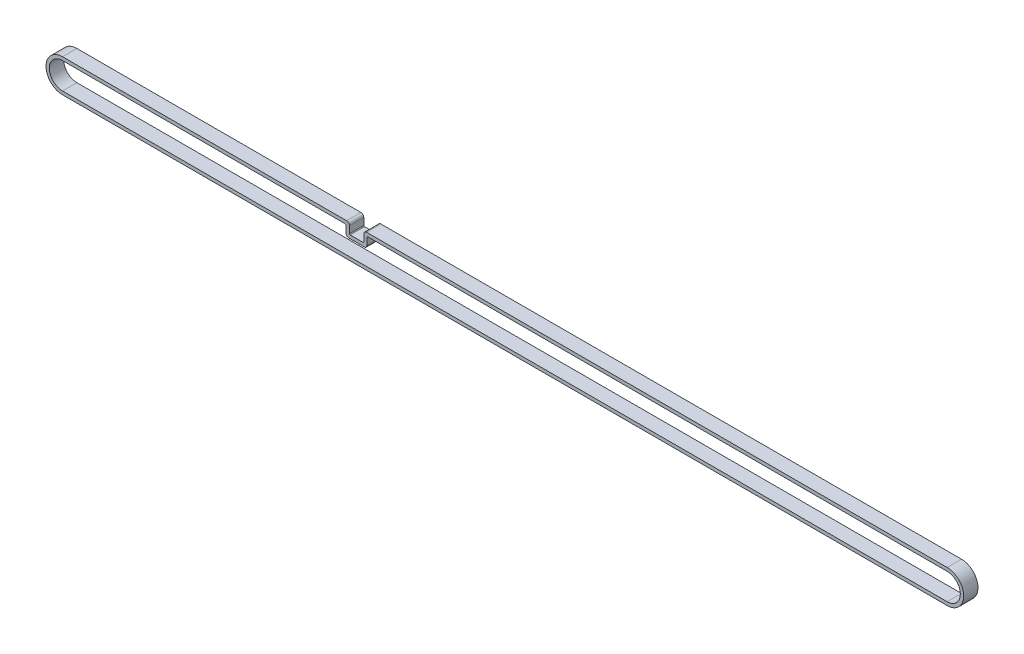
ISO-10303-21;
HEADER;
FILE_DESCRIPTION(('STEP AP214'),'2;1');
FILE_NAME('part.step','',(''),(''),'','','');
FILE_SCHEMA(('AUTOMOTIVE_DESIGN { 1 0 10303 214 1 1 1 1 }'));
ENDSEC;
DATA;
#1=APPLICATION_CONTEXT('core data for automotive mechanical design processes');
#2=APPLICATION_PROTOCOL_DEFINITION('international standard','automotive_design',2000,#1);
#3=PRODUCT_CONTEXT('',#1,'mechanical');
#4=PRODUCT('Part','Part','',(#3));
#5=PRODUCT_RELATED_PRODUCT_CATEGORY('part','',(#4));
#6=PRODUCT_DEFINITION_FORMATION('','',#4);
#7=PRODUCT_DEFINITION_CONTEXT('part definition',#1,'design');
#8=PRODUCT_DEFINITION('design','',#6,#7);
#9=PRODUCT_DEFINITION_SHAPE('','',#8);
#10=(LENGTH_UNIT() NAMED_UNIT(*) SI_UNIT(.MILLI.,.METRE.));
#11=(NAMED_UNIT(*) PLANE_ANGLE_UNIT() SI_UNIT($,.RADIAN.));
#12=(NAMED_UNIT(*) SI_UNIT($,.STERADIAN.) SOLID_ANGLE_UNIT());
#13=UNCERTAINTY_MEASURE_WITH_UNIT(LENGTH_MEASURE(1.E-05),#10,'distance_accuracy_value','');
#14=(GEOMETRIC_REPRESENTATION_CONTEXT(3) GLOBAL_UNCERTAINTY_ASSIGNED_CONTEXT((#13)) GLOBAL_UNIT_ASSIGNED_CONTEXT((#10,
#11,#12)) REPRESENTATION_CONTEXT('',''));
#15=CARTESIAN_POINT('',(0.,0.,0.));
#16=DIRECTION('',(0.,0.,1.));
#17=DIRECTION('',(1.,0.,0.));
#18=AXIS2_PLACEMENT_3D('',#15,#16,#17);
#19=CARTESIAN_POINT('',(0.,0.,6.));
#20=DIRECTION('',(0.,0.,1.));
#21=DIRECTION('',(1.,0.,0.));
#22=AXIS2_PLACEMENT_3D('',#19,#20,#21);
#23=PLANE('',#22);
#24=DIRECTION('',(-1.,0.,0.));
#25=VECTOR('',#24,1.);
#26=CARTESIAN_POINT('',(126.,6.9,6.));
#27=LINE('',#26,#25);
#28=CARTESIAN_POINT('',(370.,6.9,6.));
#29=VERTEX_POINT('',#28);
#30=CARTESIAN_POINT('',(127.2,6.9,6.));
#31=VERTEX_POINT('',#30);
#32=EDGE_CURVE('E268',#29,#31,#27,.T.);
#33=ORIENTED_EDGE('',*,*,#32,.T.);
#34=CARTESIAN_POINT('',(127.2,5.7,6.));
#35=DIRECTION('',(0.,0.,1.));
#36=DIRECTION('',(1.,0.,0.));
#37=AXIS2_PLACEMENT_3D('',#34,#35,#36);
#38=CIRCLE('',#37,1.2);
#39=CARTESIAN_POINT('',(126.,5.7,6.));
#40=VERTEX_POINT('',#39);
#41=EDGE_CURVE('E365',#31,#40,#38,.T.);
#42=ORIENTED_EDGE('',*,*,#41,.T.);
#43=DIRECTION('',(0.,-1.,0.));
#44=VECTOR('',#43,1.);
#45=CARTESIAN_POINT('',(126.,2.5,6.));
#46=LINE('',#45,#44);
#47=CARTESIAN_POINT('',(126.,2.8,6.));
#48=VERTEX_POINT('',#47);
#49=EDGE_CURVE('E271',#40,#48,#46,.T.);
#50=ORIENTED_EDGE('',*,*,#49,.T.);
#51=CARTESIAN_POINT('',(125.7,2.8,6.));
#52=DIRECTION('',(0.,0.,1.));
#53=DIRECTION('',(1.,0.,0.));
#54=AXIS2_PLACEMENT_3D('',#51,#52,#53);
#55=CIRCLE('',#54,0.3);
#56=CARTESIAN_POINT('',(125.7,2.5,6.));
#57=VERTEX_POINT('',#56);
#58=EDGE_CURVE('E343',#48,#57,#55,.F.);
#59=ORIENTED_EDGE('',*,*,#58,.T.);
#60=DIRECTION('',(-1.,0.,0.));
#61=VECTOR('',#60,1.);
#62=CARTESIAN_POINT('',(120.,2.5,6.));
#63=LINE('',#62,#61);
#64=CARTESIAN_POINT('',(120.3,2.5,6.));
#65=VERTEX_POINT('',#64);
#66=EDGE_CURVE('E273',#57,#65,#63,.T.);
#67=ORIENTED_EDGE('',*,*,#66,.T.);
#68=CARTESIAN_POINT('',(120.3,2.8,6.));
#69=DIRECTION('',(0.,0.,1.));
#70=DIRECTION('',(1.,0.,0.));
#71=AXIS2_PLACEMENT_3D('',#68,#69,#70);
#72=CIRCLE('',#71,0.3);
#73=CARTESIAN_POINT('',(120.,2.8,6.));
#74=VERTEX_POINT('',#73);
#75=EDGE_CURVE('E347',#65,#74,#72,.F.);
#76=ORIENTED_EDGE('',*,*,#75,.T.);
#77=DIRECTION('',(0.,1.,0.));
#78=VECTOR('',#77,1.);
#79=CARTESIAN_POINT('',(120.,6.9,6.));
#80=LINE('',#79,#78);
#81=CARTESIAN_POINT('',(120.,5.7,6.));
#82=VERTEX_POINT('',#81);
#83=EDGE_CURVE('E276',#74,#82,#80,.T.);
#84=ORIENTED_EDGE('',*,*,#83,.T.);
#85=CARTESIAN_POINT('',(118.8,5.7,6.));
#86=DIRECTION('',(0.,0.,1.));
#87=DIRECTION('',(1.,0.,0.));
#88=AXIS2_PLACEMENT_3D('',#85,#86,#87);
#89=CIRCLE('',#88,1.2);
#90=CARTESIAN_POINT('',(118.8,6.9,6.));
#91=VERTEX_POINT('',#90);
#92=EDGE_CURVE('E57',#82,#91,#89,.T.);
#93=ORIENTED_EDGE('',*,*,#92,.T.);
#94=DIRECTION('',(-1.,0.,0.));
#95=VECTOR('',#94,1.);
#96=CARTESIAN_POINT('',(0.,6.9,6.));
#97=LINE('',#96,#95);
#98=CARTESIAN_POINT('',(0.,6.9,6.));
#99=VERTEX_POINT('',#98);
#100=EDGE_CURVE('E278',#91,#99,#97,.T.);
#101=ORIENTED_EDGE('',*,*,#100,.T.);
#102=CARTESIAN_POINT('',(0.,0.,6.));
#103=DIRECTION('',(0.,0.,1.));
#104=DIRECTION('',(1.,0.,0.));
#105=AXIS2_PLACEMENT_3D('',#102,#103,#104);
#106=CIRCLE('',#105,6.9);
#107=CARTESIAN_POINT('',(0.,-6.9,6.));
#108=VERTEX_POINT('',#107);
#109=EDGE_CURVE('E260',#99,#108,#106,.T.);
#110=ORIENTED_EDGE('',*,*,#109,.T.);
#111=DIRECTION('',(1.,0.,0.));
#112=VECTOR('',#111,1.);
#113=CARTESIAN_POINT('',(0.,-6.9,6.));
#114=LINE('',#113,#112);
#115=CARTESIAN_POINT('',(370.,-6.9,6.));
#116=VERTEX_POINT('',#115);
#117=EDGE_CURVE('E263',#108,#116,#114,.T.);
#118=ORIENTED_EDGE('',*,*,#117,.T.);
#119=CARTESIAN_POINT('',(370.,0.,6.));
#120=DIRECTION('',(0.,0.,1.));
#121=DIRECTION('',(1.,0.,0.));
#122=AXIS2_PLACEMENT_3D('',#119,#120,#121);
#123=CIRCLE('',#122,6.9);
#124=EDGE_CURVE('E266',#116,#29,#123,.T.);
#125=ORIENTED_EDGE('',*,*,#124,.T.);
#126=EDGE_LOOP('',(#33,#42,#50,#59,#67,#76,#84,#93,#101,#110,#118,#125));
#127=FACE_BOUND('',#126,.T.);
#128=DIRECTION('',(0.,1.,0.));
#129=VECTOR('',#128,1.);
#130=CARTESIAN_POINT('',(118.6,5.5,6.));
#131=LINE('',#130,#129);
#132=CARTESIAN_POINT('',(118.6,2.3,6.));
#133=VERTEX_POINT('',#132);
#134=CARTESIAN_POINT('',(118.6,5.2,6.));
#135=VERTEX_POINT('',#134);
#136=EDGE_CURVE('E234',#133,#135,#131,.T.);
#137=ORIENTED_EDGE('',*,*,#136,.F.);
#138=CARTESIAN_POINT('',(119.8,2.3,6.));
#139=DIRECTION('',(0.,0.,1.));
#140=DIRECTION('',(1.,0.,0.));
#141=AXIS2_PLACEMENT_3D('',#138,#139,#140);
#142=CIRCLE('',#141,1.2);
#143=CARTESIAN_POINT('',(119.8,1.1,6.));
#144=VERTEX_POINT('',#143);
#145=EDGE_CURVE('E368',#133,#144,#142,.T.);
#146=ORIENTED_EDGE('',*,*,#145,.T.);
#147=DIRECTION('',(-1.,0.,0.));
#148=VECTOR('',#147,1.);
#149=CARTESIAN_POINT('',(118.6,1.1,6.));
#150=LINE('',#149,#148);
#151=CARTESIAN_POINT('',(126.2,1.1,6.));
#152=VERTEX_POINT('',#151);
#153=EDGE_CURVE('E231',#152,#144,#150,.T.);
#154=ORIENTED_EDGE('',*,*,#153,.F.);
#155=CARTESIAN_POINT('',(126.2,2.3,6.));
#156=DIRECTION('',(0.,0.,1.));
#157=DIRECTION('',(1.,0.,0.));
#158=AXIS2_PLACEMENT_3D('',#155,#156,#157);
#159=CIRCLE('',#158,1.2);
#160=CARTESIAN_POINT('',(127.4,2.3,6.));
#161=VERTEX_POINT('',#160);
#162=EDGE_CURVE('E49',#152,#161,#159,.T.);
#163=ORIENTED_EDGE('',*,*,#162,.T.);
#164=DIRECTION('',(0.,-1.,0.));
#165=VECTOR('',#164,1.);
#166=CARTESIAN_POINT('',(127.4,1.1,6.));
#167=LINE('',#166,#165);
#168=CARTESIAN_POINT('',(127.4,5.2,6.));
#169=VERTEX_POINT('',#168);
#170=EDGE_CURVE('E229',#169,#161,#167,.T.);
#171=ORIENTED_EDGE('',*,*,#170,.F.);
#172=CARTESIAN_POINT('',(127.7,5.2,6.));
#173=DIRECTION('',(0.,0.,1.));
#174=DIRECTION('',(1.,0.,0.));
#175=AXIS2_PLACEMENT_3D('',#172,#173,#174);
#176=CIRCLE('',#175,0.3);
#177=CARTESIAN_POINT('',(127.7,5.5,6.));
#178=VERTEX_POINT('',#177);
#179=EDGE_CURVE('E333',#169,#178,#176,.F.);
#180=ORIENTED_EDGE('',*,*,#179,.T.);
#181=DIRECTION('',(-1.,0.,0.));
#182=VECTOR('',#181,1.);
#183=CARTESIAN_POINT('',(127.4,5.5,6.));
#184=LINE('',#183,#182);
#185=CARTESIAN_POINT('',(370.,5.5,6.));
#186=VERTEX_POINT('',#185);
#187=EDGE_CURVE('E224',#186,#178,#184,.T.);
#188=ORIENTED_EDGE('',*,*,#187,.F.);
#189=CARTESIAN_POINT('',(370.,0.,6.));
#190=DIRECTION('',(0.,0.,1.));
#191=DIRECTION('',(1.,0.,0.));
#192=AXIS2_PLACEMENT_3D('',#189,#190,#191);
#193=CIRCLE('',#192,5.5);
#194=CARTESIAN_POINT('',(370.,-5.5,6.));
#195=VERTEX_POINT('',#194);
#196=EDGE_CURVE('E222',#195,#186,#193,.T.);
#197=ORIENTED_EDGE('',*,*,#196,.F.);
#198=DIRECTION('',(1.,0.,0.));
#199=VECTOR('',#198,1.);
#200=CARTESIAN_POINT('',(0.,-5.5,6.));
#201=LINE('',#200,#199);
#202=CARTESIAN_POINT('',(0.,-5.5,6.));
#203=VERTEX_POINT('',#202);
#204=EDGE_CURVE('E208',#203,#195,#201,.T.);
#205=ORIENTED_EDGE('',*,*,#204,.F.);
#206=CARTESIAN_POINT('',(0.,0.,6.));
#207=DIRECTION('',(0.,0.,1.));
#208=DIRECTION('',(1.,0.,0.));
#209=AXIS2_PLACEMENT_3D('',#206,#207,#208);
#210=CIRCLE('',#209,5.5);
#211=CARTESIAN_POINT('',(0.,5.5,6.));
#212=VERTEX_POINT('',#211);
#213=EDGE_CURVE('E198',#212,#203,#210,.T.);
#214=ORIENTED_EDGE('',*,*,#213,.F.);
#215=DIRECTION('',(-1.,0.,0.));
#216=VECTOR('',#215,1.);
#217=CARTESIAN_POINT('',(0.,5.5,6.));
#218=LINE('',#217,#216);
#219=CARTESIAN_POINT('',(118.3,5.5,6.));
#220=VERTEX_POINT('',#219);
#221=EDGE_CURVE('E236',#220,#212,#218,.T.);
#222=ORIENTED_EDGE('',*,*,#221,.F.);
#223=CARTESIAN_POINT('',(118.3,5.2,6.));
#224=DIRECTION('',(0.,0.,1.));
#225=DIRECTION('',(1.,0.,0.));
#226=AXIS2_PLACEMENT_3D('',#223,#224,#225);
#227=CIRCLE('',#226,0.3);
#228=EDGE_CURVE('E337',#220,#135,#227,.F.);
#229=ORIENTED_EDGE('',*,*,#228,.T.);
#230=EDGE_LOOP('',(#137,#146,#154,#163,#171,#180,#188,#197,#205,#214,#222,#229));
#231=FACE_BOUND('',#230,.T.);
#232=ADVANCED_FACE('F34',(#127,#231),#23,.T.);
#233=CARTESIAN_POINT('',(0.,0.,0.));
#234=DIRECTION('',(0.,0.,1.));
#235=DIRECTION('',(1.,0.,0.));
#236=AXIS2_PLACEMENT_3D('',#233,#234,#235);
#237=PLANE('',#236);
#238=DIRECTION('',(0.,-1.,0.));
#239=VECTOR('',#238,1.);
#240=CARTESIAN_POINT('',(126.,2.5,0.));
#241=LINE('',#240,#239);
#242=CARTESIAN_POINT('',(126.,5.7,0.));
#243=VERTEX_POINT('',#242);
#244=CARTESIAN_POINT('',(126.,2.8,0.));
#245=VERTEX_POINT('',#244);
#246=EDGE_CURVE('E290',#243,#245,#241,.T.);
#247=ORIENTED_EDGE('',*,*,#246,.F.);
#248=CARTESIAN_POINT('',(127.2,5.7,0.));
#249=DIRECTION('',(0.,0.,1.));
#250=DIRECTION('',(1.,0.,0.));
#251=AXIS2_PLACEMENT_3D('',#248,#249,#250);
#252=CIRCLE('',#251,1.2);
#253=CARTESIAN_POINT('',(127.2,6.9,0.));
#254=VERTEX_POINT('',#253);
#255=EDGE_CURVE('E356',#243,#254,#252,.F.);
#256=ORIENTED_EDGE('',*,*,#255,.T.);
#257=DIRECTION('',(-1.,0.,0.));
#258=VECTOR('',#257,1.);
#259=CARTESIAN_POINT('',(126.,6.9,0.));
#260=LINE('',#259,#258);
#261=CARTESIAN_POINT('',(370.,6.9,0.));
#262=VERTEX_POINT('',#261);
#263=EDGE_CURVE('E287',#262,#254,#260,.T.);
#264=ORIENTED_EDGE('',*,*,#263,.F.);
#265=CARTESIAN_POINT('',(370.,0.,0.));
#266=DIRECTION('',(0.,0.,1.));
#267=DIRECTION('',(1.,0.,0.));
#268=AXIS2_PLACEMENT_3D('',#265,#266,#267);
#269=CIRCLE('',#268,6.9);
#270=CARTESIAN_POINT('',(370.,-6.9,0.));
#271=VERTEX_POINT('',#270);
#272=EDGE_CURVE('E285',#271,#262,#269,.T.);
#273=ORIENTED_EDGE('',*,*,#272,.F.);
#274=DIRECTION('',(1.,0.,0.));
#275=VECTOR('',#274,1.);
#276=CARTESIAN_POINT('',(0.,-6.9,0.));
#277=LINE('',#276,#275);
#278=CARTESIAN_POINT('',(0.,-6.9,0.));
#279=VERTEX_POINT('',#278);
#280=EDGE_CURVE('E283',#279,#271,#277,.T.);
#281=ORIENTED_EDGE('',*,*,#280,.F.);
#282=CARTESIAN_POINT('',(0.,0.,0.));
#283=DIRECTION('',(0.,0.,1.));
#284=DIRECTION('',(1.,0.,0.));
#285=AXIS2_PLACEMENT_3D('',#282,#283,#284);
#286=CIRCLE('',#285,6.9);
#287=CARTESIAN_POINT('',(0.,6.9,0.));
#288=VERTEX_POINT('',#287);
#289=EDGE_CURVE('E216',#288,#279,#286,.T.);
#290=ORIENTED_EDGE('',*,*,#289,.F.);
#291=DIRECTION('',(-1.,0.,0.));
#292=VECTOR('',#291,1.);
#293=CARTESIAN_POINT('',(0.,6.9,0.));
#294=LINE('',#293,#292);
#295=CARTESIAN_POINT('',(118.8,6.9,0.));
#296=VERTEX_POINT('',#295);
#297=EDGE_CURVE('E264',#296,#288,#294,.T.);
#298=ORIENTED_EDGE('',*,*,#297,.F.);
#299=CARTESIAN_POINT('',(118.8,5.7,0.));
#300=DIRECTION('',(0.,0.,1.));
#301=DIRECTION('',(1.,0.,0.));
#302=AXIS2_PLACEMENT_3D('',#299,#300,#301);
#303=CIRCLE('',#302,1.2);
#304=CARTESIAN_POINT('',(120.,5.7,0.));
#305=VERTEX_POINT('',#304);
#306=EDGE_CURVE('E354',#296,#305,#303,.F.);
#307=ORIENTED_EDGE('',*,*,#306,.T.);
#308=DIRECTION('',(0.,1.,0.));
#309=VECTOR('',#308,1.);
#310=CARTESIAN_POINT('',(120.,6.9,0.));
#311=LINE('',#310,#309);
#312=CARTESIAN_POINT('',(120.,2.8,0.));
#313=VERTEX_POINT('',#312);
#314=EDGE_CURVE('E295',#313,#305,#311,.T.);
#315=ORIENTED_EDGE('',*,*,#314,.F.);
#316=CARTESIAN_POINT('',(120.3,2.8,0.));
#317=DIRECTION('',(0.,0.,1.));
#318=DIRECTION('',(1.,0.,0.));
#319=AXIS2_PLACEMENT_3D('',#316,#317,#318);
#320=CIRCLE('',#319,0.3);
#321=CARTESIAN_POINT('',(120.3,2.5,0.));
#322=VERTEX_POINT('',#321);
#323=EDGE_CURVE('E345',#313,#322,#320,.T.);
#324=ORIENTED_EDGE('',*,*,#323,.T.);
#325=DIRECTION('',(-1.,0.,0.));
#326=VECTOR('',#325,1.);
#327=CARTESIAN_POINT('',(120.,2.5,0.));
#328=LINE('',#327,#326);
#329=CARTESIAN_POINT('',(125.7,2.5,0.));
#330=VERTEX_POINT('',#329);
#331=EDGE_CURVE('E292',#330,#322,#328,.T.);
#332=ORIENTED_EDGE('',*,*,#331,.F.);
#333=CARTESIAN_POINT('',(125.7,2.8,0.));
#334=DIRECTION('',(0.,0.,1.));
#335=DIRECTION('',(1.,0.,0.));
#336=AXIS2_PLACEMENT_3D('',#333,#334,#335);
#337=CIRCLE('',#336,0.3);
#338=EDGE_CURVE('E340',#330,#245,#337,.T.);
#339=ORIENTED_EDGE('',*,*,#338,.T.);
#340=EDGE_LOOP('',(#247,#256,#264,#273,#281,#290,#298,#307,#315,#324,#332,#339));
#341=FACE_BOUND('',#340,.T.);
#342=DIRECTION('',(-1.,0.,0.));
#343=VECTOR('',#342,1.);
#344=CARTESIAN_POINT('',(118.6,1.1,0.));
#345=LINE('',#344,#343);
#346=CARTESIAN_POINT('',(126.2,1.1,0.));
#347=VERTEX_POINT('',#346);
#348=CARTESIAN_POINT('',(119.8,1.1,0.));
#349=VERTEX_POINT('',#348);
#350=EDGE_CURVE('E250',#347,#349,#345,.T.);
#351=ORIENTED_EDGE('',*,*,#350,.T.);
#352=CARTESIAN_POINT('',(119.8,2.3,0.));
#353=DIRECTION('',(0.,0.,1.));
#354=DIRECTION('',(1.,0.,0.));
#355=AXIS2_PLACEMENT_3D('',#352,#353,#354);
#356=CIRCLE('',#355,1.2);
#357=CARTESIAN_POINT('',(118.6,2.3,0.));
#358=VERTEX_POINT('',#357);
#359=EDGE_CURVE('E360',#349,#358,#356,.F.);
#360=ORIENTED_EDGE('',*,*,#359,.T.);
#361=DIRECTION('',(0.,1.,0.));
#362=VECTOR('',#361,1.);
#363=CARTESIAN_POINT('',(118.6,5.5,0.));
#364=LINE('',#363,#362);
#365=CARTESIAN_POINT('',(118.6,5.2,0.));
#366=VERTEX_POINT('',#365);
#367=EDGE_CURVE('E253',#358,#366,#364,.T.);
#368=ORIENTED_EDGE('',*,*,#367,.T.);
#369=CARTESIAN_POINT('',(118.3,5.2,0.));
#370=DIRECTION('',(0.,0.,1.));
#371=DIRECTION('',(1.,0.,0.));
#372=AXIS2_PLACEMENT_3D('',#369,#370,#371);
#373=CIRCLE('',#372,0.3);
#374=CARTESIAN_POINT('',(118.3,5.5,0.));
#375=VERTEX_POINT('',#374);
#376=EDGE_CURVE('E335',#366,#375,#373,.T.);
#377=ORIENTED_EDGE('',*,*,#376,.T.);
#378=DIRECTION('',(-1.,0.,0.));
#379=VECTOR('',#378,1.);
#380=CARTESIAN_POINT('',(0.,5.5,0.));
#381=LINE('',#380,#379);
#382=CARTESIAN_POINT('',(0.,5.5,0.));
#383=VERTEX_POINT('',#382);
#384=EDGE_CURVE('E209',#375,#383,#381,.T.);
#385=ORIENTED_EDGE('',*,*,#384,.T.);
#386=CARTESIAN_POINT('',(0.,0.,0.));
#387=DIRECTION('',(0.,0.,1.));
#388=DIRECTION('',(1.,0.,0.));
#389=AXIS2_PLACEMENT_3D('',#386,#387,#388);
#390=CIRCLE('',#389,5.5);
#391=CARTESIAN_POINT('',(0.,-5.5,0.));
#392=VERTEX_POINT('',#391);
#393=EDGE_CURVE('E238',#383,#392,#390,.T.);
#394=ORIENTED_EDGE('',*,*,#393,.T.);
#395=DIRECTION('',(1.,0.,0.));
#396=VECTOR('',#395,1.);
#397=CARTESIAN_POINT('',(0.,-5.5,0.));
#398=LINE('',#397,#396);
#399=CARTESIAN_POINT('',(370.,-5.5,0.));
#400=VERTEX_POINT('',#399);
#401=EDGE_CURVE('E215',#392,#400,#398,.T.);
#402=ORIENTED_EDGE('',*,*,#401,.T.);
#403=CARTESIAN_POINT('',(370.,0.,0.));
#404=DIRECTION('',(0.,0.,1.));
#405=DIRECTION('',(1.,0.,0.));
#406=AXIS2_PLACEMENT_3D('',#403,#404,#405);
#407=CIRCLE('',#406,5.5);
#408=CARTESIAN_POINT('',(370.,5.5,0.));
#409=VERTEX_POINT('',#408);
#410=EDGE_CURVE('E241',#400,#409,#407,.T.);
#411=ORIENTED_EDGE('',*,*,#410,.T.);
#412=DIRECTION('',(-1.,0.,0.));
#413=VECTOR('',#412,1.);
#414=CARTESIAN_POINT('',(127.4,5.5,0.));
#415=LINE('',#414,#413);
#416=CARTESIAN_POINT('',(127.7,5.5,0.));
#417=VERTEX_POINT('',#416);
#418=EDGE_CURVE('E244',#409,#417,#415,.T.);
#419=ORIENTED_EDGE('',*,*,#418,.T.);
#420=CARTESIAN_POINT('',(127.7,5.2,0.));
#421=DIRECTION('',(0.,0.,1.));
#422=DIRECTION('',(1.,0.,0.));
#423=AXIS2_PLACEMENT_3D('',#420,#421,#422);
#424=CIRCLE('',#423,0.3);
#425=CARTESIAN_POINT('',(127.4,5.2,0.));
#426=VERTEX_POINT('',#425);
#427=EDGE_CURVE('E331',#417,#426,#424,.T.);
#428=ORIENTED_EDGE('',*,*,#427,.T.);
#429=DIRECTION('',(0.,-1.,0.));
#430=VECTOR('',#429,1.);
#431=CARTESIAN_POINT('',(127.4,1.1,0.));
#432=LINE('',#431,#430);
#433=CARTESIAN_POINT('',(127.4,2.3,0.));
#434=VERTEX_POINT('',#433);
#435=EDGE_CURVE('E247',#426,#434,#432,.T.);
#436=ORIENTED_EDGE('',*,*,#435,.T.);
#437=CARTESIAN_POINT('',(126.2,2.3,0.));
#438=DIRECTION('',(0.,0.,1.));
#439=DIRECTION('',(1.,0.,0.));
#440=AXIS2_PLACEMENT_3D('',#437,#438,#439);
#441=CIRCLE('',#440,1.2);
#442=EDGE_CURVE('E358',#434,#347,#441,.F.);
#443=ORIENTED_EDGE('',*,*,#442,.T.);
#444=EDGE_LOOP('',(#351,#360,#368,#377,#385,#394,#402,#411,#419,#428,#436,#443));
#445=FACE_BOUND('',#444,.T.);
#446=ADVANCED_FACE('F387',(#341,#445),#237,.F.);
#447=CARTESIAN_POINT('',(0.,0.,6.));
#448=DIRECTION('',(0.,0.,-1.));
#449=DIRECTION('',(-1.,0.,0.));
#450=AXIS2_PLACEMENT_3D('',#447,#448,#449);
#451=CYLINDRICAL_SURFACE('',#450,6.9);
#452=ORIENTED_EDGE('',*,*,#289,.T.);
#453=DIRECTION('',(0.,0.,-1.));
#454=VECTOR('',#453,1.);
#455=CARTESIAN_POINT('',(0.,-6.9,6.));
#456=LINE('',#455,#454);
#457=EDGE_CURVE('E307',#108,#279,#456,.T.);
#458=ORIENTED_EDGE('',*,*,#457,.F.);
#459=ORIENTED_EDGE('',*,*,#109,.F.);
#460=DIRECTION('',(0.,0.,-1.));
#461=VECTOR('',#460,1.);
#462=CARTESIAN_POINT('',(0.,6.9,6.));
#463=LINE('',#462,#461);
#464=EDGE_CURVE('E280',#99,#288,#463,.T.);
#465=ORIENTED_EDGE('',*,*,#464,.T.);
#466=EDGE_LOOP('',(#452,#458,#459,#465));
#467=FACE_BOUND('',#466,.T.);
#468=ADVANCED_FACE('F393',(#467),#451,.T.);
#469=CARTESIAN_POINT('',(0.,-6.9,6.));
#470=DIRECTION('',(0.,1.,0.));
#471=DIRECTION('',(0.,0.,1.));
#472=AXIS2_PLACEMENT_3D('',#469,#470,#471);
#473=PLANE('',#472);
#474=ORIENTED_EDGE('',*,*,#280,.T.);
#475=DIRECTION('',(0.,0.,-1.));
#476=VECTOR('',#475,1.);
#477=CARTESIAN_POINT('',(370.,-6.9,6.));
#478=LINE('',#477,#476);
#479=EDGE_CURVE('E304',#116,#271,#478,.T.);
#480=ORIENTED_EDGE('',*,*,#479,.F.);
#481=ORIENTED_EDGE('',*,*,#117,.F.);
#482=ORIENTED_EDGE('',*,*,#457,.T.);
#483=EDGE_LOOP('',(#474,#480,#481,#482));
#484=FACE_BOUND('',#483,.T.);
#485=ADVANCED_FACE('F399',(#484),#473,.F.);
#486=CARTESIAN_POINT('',(370.,0.,6.));
#487=DIRECTION('',(0.,0.,-1.));
#488=DIRECTION('',(-1.,0.,0.));
#489=AXIS2_PLACEMENT_3D('',#486,#487,#488);
#490=CYLINDRICAL_SURFACE('',#489,6.9);
#491=ORIENTED_EDGE('',*,*,#272,.T.);
#492=DIRECTION('',(0.,0.,-1.));
#493=VECTOR('',#492,1.);
#494=CARTESIAN_POINT('',(370.,6.9,6.));
#495=LINE('',#494,#493);
#496=EDGE_CURVE('E301',#29,#262,#495,.T.);
#497=ORIENTED_EDGE('',*,*,#496,.F.);
#498=ORIENTED_EDGE('',*,*,#124,.F.);
#499=ORIENTED_EDGE('',*,*,#479,.T.);
#500=EDGE_LOOP('',(#491,#497,#498,#499));
#501=FACE_BOUND('',#500,.T.);
#502=ADVANCED_FACE('F401',(#501),#490,.T.);
#503=CARTESIAN_POINT('',(126.,6.9,6.));
#504=DIRECTION('',(0.,-1.,0.));
#505=DIRECTION('',(1.,0.,0.));
#506=AXIS2_PLACEMENT_3D('',#503,#504,#505);
#507=PLANE('',#506);
#508=ORIENTED_EDGE('',*,*,#263,.T.);
#509=DIRECTION('',(0.,0.,-1.));
#510=VECTOR('',#509,1.);
#511=CARTESIAN_POINT('',(127.2,6.9,6.));
#512=LINE('',#511,#510);
#513=EDGE_CURVE('E376',#254,#31,#512,.F.);
#514=ORIENTED_EDGE('',*,*,#513,.T.);
#515=ORIENTED_EDGE('',*,*,#32,.F.);
#516=ORIENTED_EDGE('',*,*,#496,.T.);
#517=EDGE_LOOP('',(#508,#514,#515,#516));
#518=FACE_BOUND('',#517,.T.);
#519=ADVANCED_FACE('F405',(#518),#507,.F.);
#520=CARTESIAN_POINT('',(126.,2.5,6.));
#521=DIRECTION('',(1.,0.,0.));
#522=DIRECTION('',(0.,0.,-1.));
#523=AXIS2_PLACEMENT_3D('',#520,#521,#522);
#524=PLANE('',#523);
#525=ORIENTED_EDGE('',*,*,#49,.F.);
#526=DIRECTION('',(0.,0.,-1.));
#527=VECTOR('',#526,1.);
#528=CARTESIAN_POINT('',(126.,5.7,6.));
#529=LINE('',#528,#527);
#530=EDGE_CURVE('E373',#40,#243,#529,.T.);
#531=ORIENTED_EDGE('',*,*,#530,.T.);
#532=ORIENTED_EDGE('',*,*,#246,.T.);
#533=DIRECTION('',(0.,0.,-1.));
#534=VECTOR('',#533,1.);
#535=CARTESIAN_POINT('',(126.,2.8,6.));
#536=LINE('',#535,#534);
#537=EDGE_CURVE('E325',#245,#48,#536,.F.);
#538=ORIENTED_EDGE('',*,*,#537,.T.);
#539=EDGE_LOOP('',(#525,#531,#532,#538));
#540=FACE_BOUND('',#539,.T.);
#541=ADVANCED_FACE('F413',(#540),#524,.F.);
#542=CARTESIAN_POINT('',(120.,2.5,6.));
#543=DIRECTION('',(0.,-1.,0.));
#544=DIRECTION('',(1.,0.,0.));
#545=AXIS2_PLACEMENT_3D('',#542,#543,#544);
#546=PLANE('',#545);
#547=ORIENTED_EDGE('',*,*,#66,.F.);
#548=DIRECTION('',(0.,0.,-1.));
#549=VECTOR('',#548,1.);
#550=CARTESIAN_POINT('',(125.7,2.5,0.));
#551=LINE('',#550,#549);
#552=EDGE_CURVE('E322',#57,#330,#551,.T.);
#553=ORIENTED_EDGE('',*,*,#552,.T.);
#554=ORIENTED_EDGE('',*,*,#331,.T.);
#555=DIRECTION('',(0.,0.,-1.));
#556=VECTOR('',#555,1.);
#557=CARTESIAN_POINT('',(120.3,2.5,6.));
#558=LINE('',#557,#556);
#559=EDGE_CURVE('E320',#322,#65,#558,.F.);
#560=ORIENTED_EDGE('',*,*,#559,.T.);
#561=EDGE_LOOP('',(#547,#553,#554,#560));
#562=FACE_BOUND('',#561,.T.);
#563=ADVANCED_FACE('F423',(#562),#546,.F.);
#564=CARTESIAN_POINT('',(120.,6.9,6.));
#565=DIRECTION('',(-1.,0.,0.));
#566=DIRECTION('',(0.,0.,1.));
#567=AXIS2_PLACEMENT_3D('',#564,#565,#566);
#568=PLANE('',#567);
#569=ORIENTED_EDGE('',*,*,#314,.T.);
#570=DIRECTION('',(0.,0.,-1.));
#571=VECTOR('',#570,1.);
#572=CARTESIAN_POINT('',(120.,5.7,6.));
#573=LINE('',#572,#571);
#574=EDGE_CURVE('E11',#305,#82,#573,.F.);
#575=ORIENTED_EDGE('',*,*,#574,.T.);
#576=ORIENTED_EDGE('',*,*,#83,.F.);
#577=DIRECTION('',(0.,0.,-1.));
#578=VECTOR('',#577,1.);
#579=CARTESIAN_POINT('',(120.,2.8,0.));
#580=LINE('',#579,#578);
#581=EDGE_CURVE('E328',#74,#313,#580,.T.);
#582=ORIENTED_EDGE('',*,*,#581,.T.);
#583=EDGE_LOOP('',(#569,#575,#576,#582));
#584=FACE_BOUND('',#583,.T.);
#585=ADVANCED_FACE('F430',(#584),#568,.F.);
#586=CARTESIAN_POINT('',(0.,6.9,6.));
#587=DIRECTION('',(0.,-1.,0.));
#588=DIRECTION('',(0.,0.,-1.));
#589=AXIS2_PLACEMENT_3D('',#586,#587,#588);
#590=PLANE('',#589);
#591=ORIENTED_EDGE('',*,*,#100,.F.);
#592=DIRECTION('',(0.,0.,-1.));
#593=VECTOR('',#592,1.);
#594=CARTESIAN_POINT('',(118.8,6.9,6.));
#595=LINE('',#594,#593);
#596=EDGE_CURVE('E42',#91,#296,#595,.T.);
#597=ORIENTED_EDGE('',*,*,#596,.T.);
#598=ORIENTED_EDGE('',*,*,#297,.T.);
#599=ORIENTED_EDGE('',*,*,#464,.F.);
#600=EDGE_LOOP('',(#591,#597,#598,#599));
#601=FACE_BOUND('',#600,.T.);
#602=ADVANCED_FACE('F381',(#601),#590,.F.);
#603=CARTESIAN_POINT('',(0.,0.,6.));
#604=DIRECTION('',(0.,0.,-1.));
#605=DIRECTION('',(-1.,0.,0.));
#606=AXIS2_PLACEMENT_3D('',#603,#604,#605);
#607=CYLINDRICAL_SURFACE('',#606,5.5);
#608=ORIENTED_EDGE('',*,*,#393,.F.);
#609=DIRECTION('',(0.,0.,-1.));
#610=VECTOR('',#609,1.);
#611=CARTESIAN_POINT('',(0.,5.5,6.));
#612=LINE('',#611,#610);
#613=EDGE_CURVE('E205',#212,#383,#612,.T.);
#614=ORIENTED_EDGE('',*,*,#613,.F.);
#615=ORIENTED_EDGE('',*,*,#213,.T.);
#616=DIRECTION('',(0.,0.,-1.));
#617=VECTOR('',#616,1.);
#618=CARTESIAN_POINT('',(0.,-5.5,6.));
#619=LINE('',#618,#617);
#620=EDGE_CURVE('E202',#203,#392,#619,.T.);
#621=ORIENTED_EDGE('',*,*,#620,.T.);
#622=EDGE_LOOP('',(#608,#614,#615,#621));
#623=FACE_BOUND('',#622,.T.);
#624=ADVANCED_FACE('F201',(#623),#607,.F.);
#625=CARTESIAN_POINT('',(0.,-5.5,6.));
#626=DIRECTION('',(0.,1.,0.));
#627=DIRECTION('',(0.,0.,1.));
#628=AXIS2_PLACEMENT_3D('',#625,#626,#627);
#629=PLANE('',#628);
#630=ORIENTED_EDGE('',*,*,#401,.F.);
#631=ORIENTED_EDGE('',*,*,#620,.F.);
#632=ORIENTED_EDGE('',*,*,#204,.T.);
#633=DIRECTION('',(0.,0.,-1.));
#634=VECTOR('',#633,1.);
#635=CARTESIAN_POINT('',(370.,-5.5,6.));
#636=LINE('',#635,#634);
#637=EDGE_CURVE('E217',#195,#400,#636,.T.);
#638=ORIENTED_EDGE('',*,*,#637,.T.);
#639=EDGE_LOOP('',(#630,#631,#632,#638));
#640=FACE_BOUND('',#639,.T.);
#641=ADVANCED_FACE('F212',(#640),#629,.T.);
#642=CARTESIAN_POINT('',(370.,0.,6.));
#643=DIRECTION('',(0.,0.,-1.));
#644=DIRECTION('',(-1.,0.,0.));
#645=AXIS2_PLACEMENT_3D('',#642,#643,#644);
#646=CYLINDRICAL_SURFACE('',#645,5.5);
#647=ORIENTED_EDGE('',*,*,#410,.F.);
#648=ORIENTED_EDGE('',*,*,#637,.F.);
#649=ORIENTED_EDGE('',*,*,#196,.T.);
#650=DIRECTION('',(0.,0.,-1.));
#651=VECTOR('',#650,1.);
#652=CARTESIAN_POINT('',(370.,5.5,6.));
#653=LINE('',#652,#651);
#654=EDGE_CURVE('E257',#186,#409,#653,.T.);
#655=ORIENTED_EDGE('',*,*,#654,.T.);
#656=EDGE_LOOP('',(#647,#648,#649,#655));
#657=FACE_BOUND('',#656,.T.);
#658=ADVANCED_FACE('F498',(#657),#646,.F.);
#659=CARTESIAN_POINT('',(127.4,5.5,6.));
#660=DIRECTION('',(0.,-1.,0.));
#661=DIRECTION('',(1.,0.,0.));
#662=AXIS2_PLACEMENT_3D('',#659,#660,#661);
#663=PLANE('',#662);
#664=ORIENTED_EDGE('',*,*,#187,.T.);
#665=DIRECTION('',(0.,0.,-1.));
#666=VECTOR('',#665,1.);
#667=CARTESIAN_POINT('',(127.7,5.5,0.));
#668=LINE('',#667,#666);
#669=EDGE_CURVE('E310',#178,#417,#668,.T.);
#670=ORIENTED_EDGE('',*,*,#669,.T.);
#671=ORIENTED_EDGE('',*,*,#418,.F.);
#672=ORIENTED_EDGE('',*,*,#654,.F.);
#673=EDGE_LOOP('',(#664,#670,#671,#672));
#674=FACE_BOUND('',#673,.T.);
#675=ADVANCED_FACE('F494',(#674),#663,.T.);
#676=CARTESIAN_POINT('',(127.4,1.1,6.));
#677=DIRECTION('',(1.,0.,0.));
#678=DIRECTION('',(0.,0.,-1.));
#679=AXIS2_PLACEMENT_3D('',#676,#677,#678);
#680=PLANE('',#679);
#681=ORIENTED_EDGE('',*,*,#170,.T.);
#682=DIRECTION('',(0.,0.,-1.));
#683=VECTOR('',#682,1.);
#684=CARTESIAN_POINT('',(127.4,2.3,6.));
#685=LINE('',#684,#683);
#686=EDGE_CURVE('E370',#161,#434,#685,.T.);
#687=ORIENTED_EDGE('',*,*,#686,.T.);
#688=ORIENTED_EDGE('',*,*,#435,.F.);
#689=DIRECTION('',(0.,0.,-1.));
#690=VECTOR('',#689,1.);
#691=CARTESIAN_POINT('',(127.4,5.2,6.));
#692=LINE('',#691,#690);
#693=EDGE_CURVE('E313',#426,#169,#692,.F.);
#694=ORIENTED_EDGE('',*,*,#693,.T.);
#695=EDGE_LOOP('',(#681,#687,#688,#694));
#696=FACE_BOUND('',#695,.T.);
#697=ADVANCED_FACE('F487',(#696),#680,.T.);
#698=CARTESIAN_POINT('',(118.6,1.1,6.));
#699=DIRECTION('',(0.,-1.,0.));
#700=DIRECTION('',(0.,0.,-1.));
#701=AXIS2_PLACEMENT_3D('',#698,#699,#700);
#702=PLANE('',#701);
#703=ORIENTED_EDGE('',*,*,#153,.T.);
#704=DIRECTION('',(0.,0.,-1.));
#705=VECTOR('',#704,1.);
#706=CARTESIAN_POINT('',(119.8,1.1,6.));
#707=LINE('',#706,#705);
#708=EDGE_CURVE('E351',#144,#349,#707,.T.);
#709=ORIENTED_EDGE('',*,*,#708,.T.);
#710=ORIENTED_EDGE('',*,*,#350,.F.);
#711=DIRECTION('',(0.,0.,-1.));
#712=VECTOR('',#711,1.);
#713=CARTESIAN_POINT('',(126.2,1.1,6.));
#714=LINE('',#713,#712);
#715=EDGE_CURVE('E349',#347,#152,#714,.F.);
#716=ORIENTED_EDGE('',*,*,#715,.T.);
#717=EDGE_LOOP('',(#703,#709,#710,#716));
#718=FACE_BOUND('',#717,.T.);
#719=ADVANCED_FACE('F512',(#718),#702,.T.);
#720=CARTESIAN_POINT('',(118.6,5.5,6.));
#721=DIRECTION('',(-1.,0.,0.));
#722=DIRECTION('',(0.,0.,1.));
#723=AXIS2_PLACEMENT_3D('',#720,#721,#722);
#724=PLANE('',#723);
#725=ORIENTED_EDGE('',*,*,#367,.F.);
#726=DIRECTION('',(0.,0.,-1.));
#727=VECTOR('',#726,1.);
#728=CARTESIAN_POINT('',(118.6,2.3,6.));
#729=LINE('',#728,#727);
#730=EDGE_CURVE('E362',#358,#133,#729,.F.);
#731=ORIENTED_EDGE('',*,*,#730,.T.);
#732=ORIENTED_EDGE('',*,*,#136,.T.);
#733=DIRECTION('',(0.,0.,-1.));
#734=VECTOR('',#733,1.);
#735=CARTESIAN_POINT('',(118.6,5.2,0.));
#736=LINE('',#735,#734);
#737=EDGE_CURVE('E315',#135,#366,#736,.T.);
#738=ORIENTED_EDGE('',*,*,#737,.T.);
#739=EDGE_LOOP('',(#725,#731,#732,#738));
#740=FACE_BOUND('',#739,.T.);
#741=ADVANCED_FACE('F507',(#740),#724,.T.);
#742=CARTESIAN_POINT('',(0.,5.5,6.));
#743=DIRECTION('',(0.,-1.,0.));
#744=DIRECTION('',(0.,0.,-1.));
#745=AXIS2_PLACEMENT_3D('',#742,#743,#744);
#746=PLANE('',#745);
#747=ORIENTED_EDGE('',*,*,#384,.F.);
#748=DIRECTION('',(0.,0.,-1.));
#749=VECTOR('',#748,1.);
#750=CARTESIAN_POINT('',(118.3,5.5,6.));
#751=LINE('',#750,#749);
#752=EDGE_CURVE('E318',#375,#220,#751,.F.);
#753=ORIENTED_EDGE('',*,*,#752,.T.);
#754=ORIENTED_EDGE('',*,*,#221,.T.);
#755=ORIENTED_EDGE('',*,*,#613,.T.);
#756=EDGE_LOOP('',(#747,#753,#754,#755));
#757=FACE_BOUND('',#756,.T.);
#758=ADVANCED_FACE('F466',(#757),#746,.T.);
#759=CARTESIAN_POINT('',(127.7,5.2,6.));
#760=DIRECTION('',(0.,0.,1.));
#761=DIRECTION('',(1.,0.,0.));
#762=AXIS2_PLACEMENT_3D('',#759,#760,#761);
#763=CYLINDRICAL_SURFACE('',#762,0.3);
#764=ORIENTED_EDGE('',*,*,#179,.F.);
#765=ORIENTED_EDGE('',*,*,#693,.F.);
#766=ORIENTED_EDGE('',*,*,#427,.F.);
#767=ORIENTED_EDGE('',*,*,#669,.F.);
#768=EDGE_LOOP('',(#764,#765,#766,#767));
#769=FACE_BOUND('',#768,.T.);
#770=ADVANCED_FACE('F462',(#769),#763,.F.);
#771=CARTESIAN_POINT('',(118.3,5.2,6.));
#772=DIRECTION('',(0.,0.,1.));
#773=DIRECTION('',(1.,0.,0.));
#774=AXIS2_PLACEMENT_3D('',#771,#772,#773);
#775=CYLINDRICAL_SURFACE('',#774,0.3);
#776=ORIENTED_EDGE('',*,*,#228,.F.);
#777=ORIENTED_EDGE('',*,*,#752,.F.);
#778=ORIENTED_EDGE('',*,*,#376,.F.);
#779=ORIENTED_EDGE('',*,*,#737,.F.);
#780=EDGE_LOOP('',(#776,#777,#778,#779));
#781=FACE_BOUND('',#780,.T.);
#782=ADVANCED_FACE('F465',(#781),#775,.F.);
#783=CARTESIAN_POINT('',(125.7,2.8,6.));
#784=DIRECTION('',(0.,0.,1.));
#785=DIRECTION('',(1.,0.,0.));
#786=AXIS2_PLACEMENT_3D('',#783,#784,#785);
#787=CYLINDRICAL_SURFACE('',#786,0.3);
#788=ORIENTED_EDGE('',*,*,#58,.F.);
#789=ORIENTED_EDGE('',*,*,#537,.F.);
#790=ORIENTED_EDGE('',*,*,#338,.F.);
#791=ORIENTED_EDGE('',*,*,#552,.F.);
#792=EDGE_LOOP('',(#788,#789,#790,#791));
#793=FACE_BOUND('',#792,.T.);
#794=ADVANCED_FACE('F419',(#793),#787,.F.);
#795=CARTESIAN_POINT('',(120.3,2.8,6.));
#796=DIRECTION('',(0.,0.,1.));
#797=DIRECTION('',(1.,0.,0.));
#798=AXIS2_PLACEMENT_3D('',#795,#796,#797);
#799=CYLINDRICAL_SURFACE('',#798,0.3);
#800=ORIENTED_EDGE('',*,*,#75,.F.);
#801=ORIENTED_EDGE('',*,*,#559,.F.);
#802=ORIENTED_EDGE('',*,*,#323,.F.);
#803=ORIENTED_EDGE('',*,*,#581,.F.);
#804=EDGE_LOOP('',(#800,#801,#802,#803));
#805=FACE_BOUND('',#804,.T.);
#806=ADVANCED_FACE('F426',(#805),#799,.F.);
#807=CARTESIAN_POINT('',(119.8,2.3,6.));
#808=DIRECTION('',(0.,0.,-1.));
#809=DIRECTION('',(-1.,0.,0.));
#810=AXIS2_PLACEMENT_3D('',#807,#808,#809);
#811=CYLINDRICAL_SURFACE('',#810,1.2);
#812=ORIENTED_EDGE('',*,*,#145,.F.);
#813=ORIENTED_EDGE('',*,*,#730,.F.);
#814=ORIENTED_EDGE('',*,*,#359,.F.);
#815=ORIENTED_EDGE('',*,*,#708,.F.);
#816=EDGE_LOOP('',(#812,#813,#814,#815));
#817=FACE_BOUND('',#816,.T.);
#818=ADVANCED_FACE('F475',(#817),#811,.T.);
#819=CARTESIAN_POINT('',(126.2,2.3,6.));
#820=DIRECTION('',(0.,0.,-1.));
#821=DIRECTION('',(-1.,0.,0.));
#822=AXIS2_PLACEMENT_3D('',#819,#820,#821);
#823=CYLINDRICAL_SURFACE('',#822,1.2);
#824=ORIENTED_EDGE('',*,*,#162,.F.);
#825=ORIENTED_EDGE('',*,*,#715,.F.);
#826=ORIENTED_EDGE('',*,*,#442,.F.);
#827=ORIENTED_EDGE('',*,*,#686,.F.);
#828=EDGE_LOOP('',(#824,#825,#826,#827));
#829=FACE_BOUND('',#828,.T.);
#830=ADVANCED_FACE('F436',(#829),#823,.T.);
#831=CARTESIAN_POINT('',(127.2,5.7,6.));
#832=DIRECTION('',(0.,0.,-1.));
#833=DIRECTION('',(-1.,0.,0.));
#834=AXIS2_PLACEMENT_3D('',#831,#832,#833);
#835=CYLINDRICAL_SURFACE('',#834,1.2);
#836=ORIENTED_EDGE('',*,*,#41,.F.);
#837=ORIENTED_EDGE('',*,*,#513,.F.);
#838=ORIENTED_EDGE('',*,*,#255,.F.);
#839=ORIENTED_EDGE('',*,*,#530,.F.);
#840=EDGE_LOOP('',(#836,#837,#838,#839));
#841=FACE_BOUND('',#840,.T.);
#842=ADVANCED_FACE('F411',(#841),#835,.T.);
#843=CARTESIAN_POINT('',(118.8,5.7,6.));
#844=DIRECTION('',(0.,0.,-1.));
#845=DIRECTION('',(-1.,0.,0.));
#846=AXIS2_PLACEMENT_3D('',#843,#844,#845);
#847=CYLINDRICAL_SURFACE('',#846,1.2);
#848=ORIENTED_EDGE('',*,*,#92,.F.);
#849=ORIENTED_EDGE('',*,*,#574,.F.);
#850=ORIENTED_EDGE('',*,*,#306,.F.);
#851=ORIENTED_EDGE('',*,*,#596,.F.);
#852=EDGE_LOOP('',(#848,#849,#850,#851));
#853=FACE_BOUND('',#852,.T.);
#854=ADVANCED_FACE('F36',(#853),#847,.T.);
#855=CLOSED_SHELL('',(#232,#446,#468,#485,#502,#519,#541,#563,#585,#602,#624,#641,#658,#675,
#697,#719,#741,#758,#770,#782,#794,#806,#818,#830,#842,#854));
#856=MANIFOLD_SOLID_BREP('B2',#855);
#857=ADVANCED_BREP_SHAPE_REPRESENTATION('',(#18,#856),#14);
#858=SHAPE_DEFINITION_REPRESENTATION(#9,#857);
ENDSEC;
END-ISO-10303-21;
